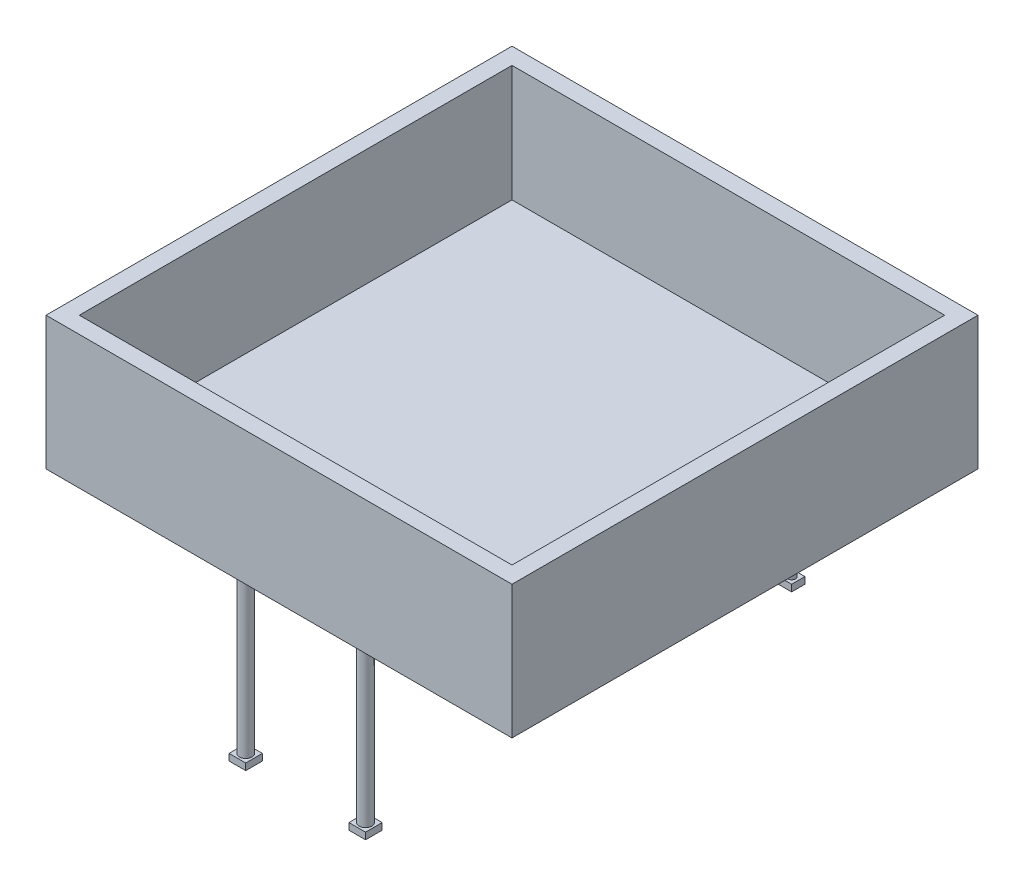
ISO-10303-21;
HEADER;
FILE_DESCRIPTION(('STEP AP214'),'2;1');
FILE_NAME('part.step','',(''),(''),'','','');
FILE_SCHEMA(('AUTOMOTIVE_DESIGN { 1 0 10303 214 1 1 1 1 }'));
ENDSEC;
DATA;
#1=APPLICATION_CONTEXT('core data for automotive mechanical design processes');
#2=APPLICATION_PROTOCOL_DEFINITION('international standard','automotive_design',2000,#1);
#3=PRODUCT_CONTEXT('',#1,'mechanical');
#4=PRODUCT('Part','Part','',(#3));
#5=PRODUCT_RELATED_PRODUCT_CATEGORY('part','',(#4));
#6=PRODUCT_DEFINITION_FORMATION('','',#4);
#7=PRODUCT_DEFINITION_CONTEXT('part definition',#1,'design');
#8=PRODUCT_DEFINITION('design','',#6,#7);
#9=PRODUCT_DEFINITION_SHAPE('','',#8);
#10=(LENGTH_UNIT() NAMED_UNIT(*) SI_UNIT(.MILLI.,.METRE.));
#11=(NAMED_UNIT(*) PLANE_ANGLE_UNIT() SI_UNIT($,.RADIAN.));
#12=(NAMED_UNIT(*) SI_UNIT($,.STERADIAN.) SOLID_ANGLE_UNIT());
#13=UNCERTAINTY_MEASURE_WITH_UNIT(LENGTH_MEASURE(1.E-05),#10,'distance_accuracy_value','');
#14=(GEOMETRIC_REPRESENTATION_CONTEXT(3) GLOBAL_UNCERTAINTY_ASSIGNED_CONTEXT((#13)) GLOBAL_UNIT_ASSIGNED_CONTEXT((#10,
#11,#12)) REPRESENTATION_CONTEXT('',''));
#15=CARTESIAN_POINT('',(0.,0.,0.));
#16=DIRECTION('',(0.,0.,1.));
#17=DIRECTION('',(1.,0.,0.));
#18=AXIS2_PLACEMENT_3D('',#15,#16,#17);
#19=CARTESIAN_POINT('',(-70.,40.,70.));
#20=DIRECTION('',(1.,0.,0.));
#21=DIRECTION('',(0.,0.,-1.));
#22=AXIS2_PLACEMENT_3D('',#19,#20,#21);
#23=PLANE('',#22);
#24=DIRECTION('',(0.,0.,1.));
#25=VECTOR('',#24,1.);
#26=CARTESIAN_POINT('',(-70.,0.,70.));
#27=LINE('',#26,#25);
#28=CARTESIAN_POINT('',(-70.,0.,-70.));
#29=VERTEX_POINT('',#28);
#30=CARTESIAN_POINT('',(-70.,0.,70.));
#31=VERTEX_POINT('',#30);
#32=EDGE_CURVE('E363',#29,#31,#27,.T.);
#33=ORIENTED_EDGE('',*,*,#32,.T.);
#34=DIRECTION('',(0.,-1.,0.));
#35=VECTOR('',#34,1.);
#36=CARTESIAN_POINT('',(-70.,40.,70.));
#37=LINE('',#36,#35);
#38=CARTESIAN_POINT('',(-70.,40.,70.));
#39=VERTEX_POINT('',#38);
#40=EDGE_CURVE('E389',#39,#31,#37,.T.);
#41=ORIENTED_EDGE('',*,*,#40,.F.);
#42=DIRECTION('',(0.,0.,1.));
#43=VECTOR('',#42,1.);
#44=CARTESIAN_POINT('',(-70.,40.,70.));
#45=LINE('',#44,#43);
#46=CARTESIAN_POINT('',(-70.,40.,-70.));
#47=VERTEX_POINT('',#46);
#48=EDGE_CURVE('E369',#47,#39,#45,.T.);
#49=ORIENTED_EDGE('',*,*,#48,.F.);
#50=DIRECTION('',(0.,-1.,0.));
#51=VECTOR('',#50,1.);
#52=CARTESIAN_POINT('',(-70.,40.,-70.));
#53=LINE('',#52,#51);
#54=EDGE_CURVE('E375',#47,#29,#53,.T.);
#55=ORIENTED_EDGE('',*,*,#54,.T.);
#56=EDGE_LOOP('',(#33,#41,#49,#55));
#57=FACE_BOUND('',#56,.T.);
#58=ADVANCED_FACE('F36',(#57),#23,.F.);
#59=CARTESIAN_POINT('',(70.,40.,70.));
#60=DIRECTION('',(0.,0.,-1.));
#61=DIRECTION('',(-1.,0.,0.));
#62=AXIS2_PLACEMENT_3D('',#59,#60,#61);
#63=PLANE('',#62);
#64=DIRECTION('',(1.,0.,0.));
#65=VECTOR('',#64,1.);
#66=CARTESIAN_POINT('',(70.,0.,70.));
#67=LINE('',#66,#65);
#68=CARTESIAN_POINT('',(70.,0.,70.));
#69=VERTEX_POINT('',#68);
#70=EDGE_CURVE('E378',#31,#69,#67,.T.);
#71=ORIENTED_EDGE('',*,*,#70,.T.);
#72=DIRECTION('',(0.,-1.,0.));
#73=VECTOR('',#72,1.);
#74=CARTESIAN_POINT('',(70.,40.,70.));
#75=LINE('',#74,#73);
#76=CARTESIAN_POINT('',(70.,40.,70.));
#77=VERTEX_POINT('',#76);
#78=EDGE_CURVE('E386',#77,#69,#75,.T.);
#79=ORIENTED_EDGE('',*,*,#78,.F.);
#80=DIRECTION('',(1.,0.,0.));
#81=VECTOR('',#80,1.);
#82=CARTESIAN_POINT('',(70.,40.,70.));
#83=LINE('',#82,#81);
#84=EDGE_CURVE('E88',#39,#77,#83,.T.);
#85=ORIENTED_EDGE('',*,*,#84,.F.);
#86=ORIENTED_EDGE('',*,*,#40,.T.);
#87=EDGE_LOOP('',(#71,#79,#85,#86));
#88=FACE_BOUND('',#87,.T.);
#89=ADVANCED_FACE('F422',(#88),#63,.F.);
#90=CARTESIAN_POINT('',(70.,40.,70.));
#91=DIRECTION('',(-1.,0.,0.));
#92=DIRECTION('',(0.,0.,1.));
#93=AXIS2_PLACEMENT_3D('',#90,#91,#92);
#94=PLANE('',#93);
#95=DIRECTION('',(0.,0.,-1.));
#96=VECTOR('',#95,1.);
#97=CARTESIAN_POINT('',(70.,0.,70.));
#98=LINE('',#97,#96);
#99=CARTESIAN_POINT('',(70.,0.,-70.));
#100=VERTEX_POINT('',#99);
#101=EDGE_CURVE('E380',#69,#100,#98,.T.);
#102=ORIENTED_EDGE('',*,*,#101,.T.);
#103=DIRECTION('',(0.,-1.,0.));
#104=VECTOR('',#103,1.);
#105=CARTESIAN_POINT('',(70.,40.,-70.));
#106=LINE('',#105,#104);
#107=CARTESIAN_POINT('',(70.,40.,-70.));
#108=VERTEX_POINT('',#107);
#109=EDGE_CURVE('E384',#108,#100,#106,.T.);
#110=ORIENTED_EDGE('',*,*,#109,.F.);
#111=DIRECTION('',(0.,0.,-1.));
#112=VECTOR('',#111,1.);
#113=CARTESIAN_POINT('',(70.,40.,70.));
#114=LINE('',#113,#112);
#115=EDGE_CURVE('E372',#77,#108,#114,.T.);
#116=ORIENTED_EDGE('',*,*,#115,.F.);
#117=ORIENTED_EDGE('',*,*,#78,.T.);
#118=EDGE_LOOP('',(#102,#110,#116,#117));
#119=FACE_BOUND('',#118,.T.);
#120=ADVANCED_FACE('F421',(#119),#94,.F.);
#121=CARTESIAN_POINT('',(70.,40.,-70.));
#122=DIRECTION('',(0.,0.,1.));
#123=DIRECTION('',(1.,0.,0.));
#124=AXIS2_PLACEMENT_3D('',#121,#122,#123);
#125=PLANE('',#124);
#126=DIRECTION('',(-1.,0.,0.));
#127=VECTOR('',#126,1.);
#128=CARTESIAN_POINT('',(70.,0.,-70.));
#129=LINE('',#128,#127);
#130=EDGE_CURVE('E80',#100,#29,#129,.T.);
#131=ORIENTED_EDGE('',*,*,#130,.T.);
#132=ORIENTED_EDGE('',*,*,#54,.F.);
#133=DIRECTION('',(-1.,0.,0.));
#134=VECTOR('',#133,1.);
#135=CARTESIAN_POINT('',(70.,40.,-70.));
#136=LINE('',#135,#134);
#137=EDGE_CURVE('E59',#108,#47,#136,.T.);
#138=ORIENTED_EDGE('',*,*,#137,.F.);
#139=ORIENTED_EDGE('',*,*,#109,.T.);
#140=EDGE_LOOP('',(#131,#132,#138,#139));
#141=FACE_BOUND('',#140,.T.);
#142=ADVANCED_FACE('F417',(#141),#125,.F.);
#143=CARTESIAN_POINT('',(0.,40.,0.));
#144=DIRECTION('',(0.,1.,0.));
#145=DIRECTION('',(0.,0.,1.));
#146=AXIS2_PLACEMENT_3D('',#143,#144,#145);
#147=PLANE('',#146);
#148=DIRECTION('',(-1.,0.,0.));
#149=VECTOR('',#148,1.);
#150=CARTESIAN_POINT('',(65.,40.,-65.));
#151=LINE('',#150,#149);
#152=CARTESIAN_POINT('',(65.,40.,-65.));
#153=VERTEX_POINT('',#152);
#154=CARTESIAN_POINT('',(-65.,40.,-65.));
#155=VERTEX_POINT('',#154);
#156=EDGE_CURVE('E50',#153,#155,#151,.T.);
#157=ORIENTED_EDGE('',*,*,#156,.F.);
#158=DIRECTION('',(0.,0.,-1.));
#159=VECTOR('',#158,1.);
#160=CARTESIAN_POINT('',(65.,40.,65.));
#161=LINE('',#160,#159);
#162=CARTESIAN_POINT('',(65.,40.,65.));
#163=VERTEX_POINT('',#162);
#164=EDGE_CURVE('E342',#163,#153,#161,.T.);
#165=ORIENTED_EDGE('',*,*,#164,.F.);
#166=DIRECTION('',(1.,0.,0.));
#167=VECTOR('',#166,1.);
#168=CARTESIAN_POINT('',(-65.,40.,65.));
#169=LINE('',#168,#167);
#170=CARTESIAN_POINT('',(-65.,40.,65.));
#171=VERTEX_POINT('',#170);
#172=EDGE_CURVE('E356',#171,#163,#169,.T.);
#173=ORIENTED_EDGE('',*,*,#172,.F.);
#174=DIRECTION('',(0.,0.,1.));
#175=VECTOR('',#174,1.);
#176=CARTESIAN_POINT('',(-65.,40.,-65.));
#177=LINE('',#176,#175);
#178=EDGE_CURVE('E353',#155,#171,#177,.T.);
#179=ORIENTED_EDGE('',*,*,#178,.F.);
#180=EDGE_LOOP('',(#157,#165,#173,#179));
#181=FACE_BOUND('',#180,.T.);
#182=ORIENTED_EDGE('',*,*,#48,.T.);
#183=ORIENTED_EDGE('',*,*,#84,.T.);
#184=ORIENTED_EDGE('',*,*,#115,.T.);
#185=ORIENTED_EDGE('',*,*,#137,.T.);
#186=EDGE_LOOP('',(#182,#183,#184,#185));
#187=FACE_BOUND('',#186,.T.);
#188=ADVANCED_FACE('F405',(#181,#187),#147,.T.);
#189=CARTESIAN_POINT('',(0.,0.,0.));
#190=DIRECTION('',(0.,1.,0.));
#191=DIRECTION('',(0.,0.,1.));
#192=AXIS2_PLACEMENT_3D('',#189,#190,#191);
#193=PLANE('',#192);
#194=CARTESIAN_POINT('',(20.,0.,-64.));
#195=DIRECTION('',(0.,1.,0.));
#196=DIRECTION('',(0.,0.,1.));
#197=AXIS2_PLACEMENT_3D('',#194,#195,#196);
#198=CIRCLE('',#197,1.20000000000001);
#199=CARTESIAN_POINT('',(20.,0.,-62.8));
#200=VERTEX_POINT('',#199);
#201=EDGE_CURVE('E11',#200,#200,#198,.F.);
#202=ORIENTED_EDGE('',*,*,#201,.F.);
#203=EDGE_LOOP('',(#202));
#204=FACE_BOUND('',#203,.T.);
#205=CARTESIAN_POINT('',(20.,0.,64.));
#206=DIRECTION('',(0.,1.,0.));
#207=DIRECTION('',(0.,0.,1.));
#208=AXIS2_PLACEMENT_3D('',#205,#206,#207);
#209=CIRCLE('',#208,1.9);
#210=CARTESIAN_POINT('',(20.,0.,65.9));
#211=VERTEX_POINT('',#210);
#212=EDGE_CURVE('E43',#211,#211,#209,.F.);
#213=ORIENTED_EDGE('',*,*,#212,.F.);
#214=EDGE_LOOP('',(#213));
#215=FACE_BOUND('',#214,.T.);
#216=CARTESIAN_POINT('',(-16.,0.,64.));
#217=DIRECTION('',(0.,1.,0.));
#218=DIRECTION('',(0.,0.,1.));
#219=AXIS2_PLACEMENT_3D('',#216,#217,#218);
#220=CIRCLE('',#219,1.9);
#221=CARTESIAN_POINT('',(-16.,0.,65.9));
#222=VERTEX_POINT('',#221);
#223=EDGE_CURVE('E394',#222,#222,#220,.F.);
#224=ORIENTED_EDGE('',*,*,#223,.F.);
#225=EDGE_LOOP('',(#224));
#226=FACE_BOUND('',#225,.T.);
#227=CARTESIAN_POINT('',(-16.,0.,-64.));
#228=DIRECTION('',(0.,1.,0.));
#229=DIRECTION('',(0.,0.,1.));
#230=AXIS2_PLACEMENT_3D('',#227,#228,#229);
#231=CIRCLE('',#230,1.20000000000001);
#232=CARTESIAN_POINT('',(-16.,0.,-62.8));
#233=VERTEX_POINT('',#232);
#234=EDGE_CURVE('E391',#233,#233,#231,.F.);
#235=ORIENTED_EDGE('',*,*,#234,.F.);
#236=EDGE_LOOP('',(#235));
#237=FACE_BOUND('',#236,.T.);
#238=ORIENTED_EDGE('',*,*,#32,.F.);
#239=ORIENTED_EDGE('',*,*,#130,.F.);
#240=ORIENTED_EDGE('',*,*,#101,.F.);
#241=ORIENTED_EDGE('',*,*,#70,.F.);
#242=EDGE_LOOP('',(#238,#239,#240,#241));
#243=FACE_BOUND('',#242,.T.);
#244=ADVANCED_FACE('F401',(#204,#215,#226,#237,#243),#193,.F.);
#245=CARTESIAN_POINT('',(65.,5.,-65.));
#246=DIRECTION('',(0.,0.,-1.));
#247=DIRECTION('',(-1.,0.,0.));
#248=AXIS2_PLACEMENT_3D('',#245,#246,#247);
#249=PLANE('',#248);
#250=ORIENTED_EDGE('',*,*,#156,.T.);
#251=DIRECTION('',(0.,1.,0.));
#252=VECTOR('',#251,1.);
#253=CARTESIAN_POINT('',(-65.,5.,-65.));
#254=LINE('',#253,#252);
#255=CARTESIAN_POINT('',(-65.,5.,-65.));
#256=VERTEX_POINT('',#255);
#257=EDGE_CURVE('E351',#256,#155,#254,.T.);
#258=ORIENTED_EDGE('',*,*,#257,.F.);
#259=DIRECTION('',(-1.,0.,0.));
#260=VECTOR('',#259,1.);
#261=CARTESIAN_POINT('',(65.,5.,-65.));
#262=LINE('',#261,#260);
#263=CARTESIAN_POINT('',(65.,5.,-65.));
#264=VERTEX_POINT('',#263);
#265=EDGE_CURVE('E338',#264,#256,#262,.T.);
#266=ORIENTED_EDGE('',*,*,#265,.F.);
#267=DIRECTION('',(0.,1.,0.));
#268=VECTOR('',#267,1.);
#269=CARTESIAN_POINT('',(65.,5.,-65.));
#270=LINE('',#269,#268);
#271=EDGE_CURVE('E361',#264,#153,#270,.T.);
#272=ORIENTED_EDGE('',*,*,#271,.T.);
#273=EDGE_LOOP('',(#250,#258,#266,#272));
#274=FACE_BOUND('',#273,.T.);
#275=ADVANCED_FACE('F404',(#274),#249,.F.);
#276=CARTESIAN_POINT('',(65.,5.,65.));
#277=DIRECTION('',(1.,0.,0.));
#278=DIRECTION('',(0.,0.,-1.));
#279=AXIS2_PLACEMENT_3D('',#276,#277,#278);
#280=PLANE('',#279);
#281=ORIENTED_EDGE('',*,*,#164,.T.);
#282=ORIENTED_EDGE('',*,*,#271,.F.);
#283=DIRECTION('',(0.,0.,-1.));
#284=VECTOR('',#283,1.);
#285=CARTESIAN_POINT('',(65.,5.,65.));
#286=LINE('',#285,#284);
#287=CARTESIAN_POINT('',(65.,5.,65.));
#288=VERTEX_POINT('',#287);
#289=EDGE_CURVE('E348',#288,#264,#286,.T.);
#290=ORIENTED_EDGE('',*,*,#289,.F.);
#291=DIRECTION('',(0.,1.,0.));
#292=VECTOR('',#291,1.);
#293=CARTESIAN_POINT('',(65.,5.,65.));
#294=LINE('',#293,#292);
#295=EDGE_CURVE('E364',#288,#163,#294,.T.);
#296=ORIENTED_EDGE('',*,*,#295,.T.);
#297=EDGE_LOOP('',(#281,#282,#290,#296));
#298=FACE_BOUND('',#297,.T.);
#299=ADVANCED_FACE('F437',(#298),#280,.F.);
#300=CARTESIAN_POINT('',(-65.,5.,65.));
#301=DIRECTION('',(0.,0.,1.));
#302=DIRECTION('',(1.,0.,0.));
#303=AXIS2_PLACEMENT_3D('',#300,#301,#302);
#304=PLANE('',#303);
#305=ORIENTED_EDGE('',*,*,#172,.T.);
#306=ORIENTED_EDGE('',*,*,#295,.F.);
#307=DIRECTION('',(1.,0.,0.));
#308=VECTOR('',#307,1.);
#309=CARTESIAN_POINT('',(-65.,5.,65.));
#310=LINE('',#309,#308);
#311=CARTESIAN_POINT('',(-65.,5.,65.));
#312=VERTEX_POINT('',#311);
#313=EDGE_CURVE('E345',#312,#288,#310,.T.);
#314=ORIENTED_EDGE('',*,*,#313,.F.);
#315=DIRECTION('',(0.,1.,0.));
#316=VECTOR('',#315,1.);
#317=CARTESIAN_POINT('',(-65.,5.,65.));
#318=LINE('',#317,#316);
#319=EDGE_CURVE('E366',#312,#171,#318,.T.);
#320=ORIENTED_EDGE('',*,*,#319,.T.);
#321=EDGE_LOOP('',(#305,#306,#314,#320));
#322=FACE_BOUND('',#321,.T.);
#323=ADVANCED_FACE('F442',(#322),#304,.F.);
#324=CARTESIAN_POINT('',(-65.,5.,-65.));
#325=DIRECTION('',(-1.,0.,0.));
#326=DIRECTION('',(0.,0.,1.));
#327=AXIS2_PLACEMENT_3D('',#324,#325,#326);
#328=PLANE('',#327);
#329=ORIENTED_EDGE('',*,*,#178,.T.);
#330=ORIENTED_EDGE('',*,*,#319,.F.);
#331=DIRECTION('',(0.,0.,1.));
#332=VECTOR('',#331,1.);
#333=CARTESIAN_POINT('',(-65.,5.,-65.));
#334=LINE('',#333,#332);
#335=EDGE_CURVE('E341',#256,#312,#334,.T.);
#336=ORIENTED_EDGE('',*,*,#335,.F.);
#337=ORIENTED_EDGE('',*,*,#257,.T.);
#338=EDGE_LOOP('',(#329,#330,#336,#337));
#339=FACE_BOUND('',#338,.T.);
#340=ADVANCED_FACE('F438',(#339),#328,.F.);
#341=CARTESIAN_POINT('',(0.,5.,0.));
#342=DIRECTION('',(0.,1.,0.));
#343=DIRECTION('',(0.,0.,1.));
#344=AXIS2_PLACEMENT_3D('',#341,#342,#343);
#345=PLANE('',#344);
#346=ORIENTED_EDGE('',*,*,#265,.T.);
#347=ORIENTED_EDGE('',*,*,#335,.T.);
#348=ORIENTED_EDGE('',*,*,#313,.T.);
#349=ORIENTED_EDGE('',*,*,#289,.T.);
#350=EDGE_LOOP('',(#346,#347,#348,#349));
#351=FACE_BOUND('',#350,.T.);
#352=ADVANCED_FACE('F441',(#351),#345,.T.);
#353=CARTESIAN_POINT('',(-16.,-50.,-64.));
#354=DIRECTION('',(0.,1.,0.));
#355=DIRECTION('',(0.,0.,1.));
#356=AXIS2_PLACEMENT_3D('',#353,#354,#355);
#357=CYLINDRICAL_SURFACE('',#356,1.20000000000001);
#358=CARTESIAN_POINT('',(-16.,-50.,-64.));
#359=DIRECTION('',(0.,-1.,0.));
#360=DIRECTION('',(0.,0.,-1.));
#361=AXIS2_PLACEMENT_3D('',#358,#359,#360);
#362=CIRCLE('',#361,1.20000000000001);
#363=CARTESIAN_POINT('',(-16.,-50.,-65.2));
#364=VERTEX_POINT('',#363);
#365=EDGE_CURVE('E335',#364,#364,#362,.T.);
#366=ORIENTED_EDGE('',*,*,#365,.F.);
#367=EDGE_LOOP('',(#366));
#368=FACE_BOUND('',#367,.T.);
#369=ORIENTED_EDGE('',*,*,#234,.T.);
#370=EDGE_LOOP('',(#369));
#371=FACE_BOUND('',#370,.T.);
#372=ADVANCED_FACE('F452',(#368,#371),#357,.T.);
#373=CARTESIAN_POINT('',(-16.,-50.,64.));
#374=DIRECTION('',(0.,1.,0.));
#375=DIRECTION('',(0.,0.,1.));
#376=AXIS2_PLACEMENT_3D('',#373,#374,#375);
#377=CYLINDRICAL_SURFACE('',#376,1.9);
#378=CARTESIAN_POINT('',(-16.,-50.,64.));
#379=DIRECTION('',(0.,-1.,0.));
#380=DIRECTION('',(0.,0.,-1.));
#381=AXIS2_PLACEMENT_3D('',#378,#379,#380);
#382=CIRCLE('',#381,1.9);
#383=CARTESIAN_POINT('',(-16.,-50.,62.1));
#384=VERTEX_POINT('',#383);
#385=EDGE_CURVE('E332',#384,#384,#382,.T.);
#386=ORIENTED_EDGE('',*,*,#385,.F.);
#387=EDGE_LOOP('',(#386));
#388=FACE_BOUND('',#387,.T.);
#389=ORIENTED_EDGE('',*,*,#223,.T.);
#390=EDGE_LOOP('',(#389));
#391=FACE_BOUND('',#390,.T.);
#392=ADVANCED_FACE('F456',(#388,#391),#377,.T.);
#393=CARTESIAN_POINT('',(20.,-50.,64.));
#394=DIRECTION('',(0.,1.,0.));
#395=DIRECTION('',(0.,0.,1.));
#396=AXIS2_PLACEMENT_3D('',#393,#394,#395);
#397=CYLINDRICAL_SURFACE('',#396,1.9);
#398=CARTESIAN_POINT('',(20.,-50.,64.));
#399=DIRECTION('',(0.,-1.,0.));
#400=DIRECTION('',(0.,0.,1.));
#401=AXIS2_PLACEMENT_3D('',#398,#399,#400);
#402=CIRCLE('',#401,1.9);
#403=CARTESIAN_POINT('',(20.,-50.,65.9));
#404=VERTEX_POINT('',#403);
#405=EDGE_CURVE('E329',#404,#404,#402,.T.);
#406=ORIENTED_EDGE('',*,*,#405,.F.);
#407=EDGE_LOOP('',(#406));
#408=FACE_BOUND('',#407,.T.);
#409=ORIENTED_EDGE('',*,*,#212,.T.);
#410=EDGE_LOOP('',(#409));
#411=FACE_BOUND('',#410,.T.);
#412=ADVANCED_FACE('F399',(#408,#411),#397,.T.);
#413=CARTESIAN_POINT('',(20.,-50.,-64.));
#414=DIRECTION('',(0.,1.,0.));
#415=DIRECTION('',(0.,0.,1.));
#416=AXIS2_PLACEMENT_3D('',#413,#414,#415);
#417=CYLINDRICAL_SURFACE('',#416,1.20000000000001);
#418=CARTESIAN_POINT('',(20.,-50.,-64.));
#419=DIRECTION('',(0.,-1.,0.));
#420=DIRECTION('',(0.,0.,1.));
#421=AXIS2_PLACEMENT_3D('',#418,#419,#420);
#422=CIRCLE('',#421,1.20000000000001);
#423=CARTESIAN_POINT('',(20.,-50.,-62.8));
#424=VERTEX_POINT('',#423);
#425=EDGE_CURVE('E326',#424,#424,#422,.T.);
#426=ORIENTED_EDGE('',*,*,#425,.F.);
#427=EDGE_LOOP('',(#426));
#428=FACE_BOUND('',#427,.T.);
#429=ORIENTED_EDGE('',*,*,#201,.T.);
#430=EDGE_LOOP('',(#429));
#431=FACE_BOUND('',#430,.T.);
#432=ADVANCED_FACE('F463',(#428,#431),#417,.T.);
#433=CARTESIAN_POINT('',(-18.5,-52.,61.5));
#434=DIRECTION('',(1.,0.,0.));
#435=DIRECTION('',(0.,0.,-1.));
#436=AXIS2_PLACEMENT_3D('',#433,#434,#435);
#437=PLANE('',#436);
#438=DIRECTION('',(0.,0.,-1.));
#439=VECTOR('',#438,1.);
#440=CARTESIAN_POINT('',(-18.5,-50.,61.5));
#441=LINE('',#440,#439);
#442=CARTESIAN_POINT('',(-18.5,-50.,66.5));
#443=VERTEX_POINT('',#442);
#444=CARTESIAN_POINT('',(-18.5,-50.,61.5));
#445=VERTEX_POINT('',#444);
#446=EDGE_CURVE('E296',#443,#445,#441,.T.);
#447=ORIENTED_EDGE('',*,*,#446,.T.);
#448=DIRECTION('',(0.,1.,0.));
#449=VECTOR('',#448,1.);
#450=CARTESIAN_POINT('',(-18.5,-52.,61.5));
#451=LINE('',#450,#449);
#452=CARTESIAN_POINT('',(-18.5,-52.,61.5));
#453=VERTEX_POINT('',#452);
#454=EDGE_CURVE('E323',#453,#445,#451,.T.);
#455=ORIENTED_EDGE('',*,*,#454,.F.);
#456=DIRECTION('',(0.,0.,-1.));
#457=VECTOR('',#456,1.);
#458=CARTESIAN_POINT('',(-18.5,-52.,61.5));
#459=LINE('',#458,#457);
#460=CARTESIAN_POINT('',(-18.5,-52.,66.5));
#461=VERTEX_POINT('',#460);
#462=EDGE_CURVE('E297',#461,#453,#459,.T.);
#463=ORIENTED_EDGE('',*,*,#462,.F.);
#464=DIRECTION('',(0.,1.,0.));
#465=VECTOR('',#464,1.);
#466=CARTESIAN_POINT('',(-18.5,-52.,66.5));
#467=LINE('',#466,#465);
#468=EDGE_CURVE('E307',#461,#443,#467,.T.);
#469=ORIENTED_EDGE('',*,*,#468,.T.);
#470=EDGE_LOOP('',(#447,#455,#463,#469));
#471=FACE_BOUND('',#470,.T.);
#472=ADVANCED_FACE('F467',(#471),#437,.F.);
#473=CARTESIAN_POINT('',(-13.5,-52.,61.5));
#474=DIRECTION('',(0.,0.,1.));
#475=DIRECTION('',(1.,0.,0.));
#476=AXIS2_PLACEMENT_3D('',#473,#474,#475);
#477=PLANE('',#476);
#478=DIRECTION('',(1.,0.,0.));
#479=VECTOR('',#478,1.);
#480=CARTESIAN_POINT('',(-13.5,-50.,61.5));
#481=LINE('',#480,#479);
#482=CARTESIAN_POINT('',(-13.5,-50.,61.5));
#483=VERTEX_POINT('',#482);
#484=EDGE_CURVE('E310',#445,#483,#481,.T.);
#485=ORIENTED_EDGE('',*,*,#484,.T.);
#486=DIRECTION('',(0.,1.,0.));
#487=VECTOR('',#486,1.);
#488=CARTESIAN_POINT('',(-13.5,-52.,61.5));
#489=LINE('',#488,#487);
#490=CARTESIAN_POINT('',(-13.5,-52.,61.5));
#491=VERTEX_POINT('',#490);
#492=EDGE_CURVE('E320',#491,#483,#489,.T.);
#493=ORIENTED_EDGE('',*,*,#492,.F.);
#494=DIRECTION('',(1.,0.,0.));
#495=VECTOR('',#494,1.);
#496=CARTESIAN_POINT('',(-13.5,-52.,61.5));
#497=LINE('',#496,#495);
#498=EDGE_CURVE('E300',#453,#491,#497,.T.);
#499=ORIENTED_EDGE('',*,*,#498,.F.);
#500=ORIENTED_EDGE('',*,*,#454,.T.);
#501=EDGE_LOOP('',(#485,#493,#499,#500));
#502=FACE_BOUND('',#501,.T.);
#503=ADVANCED_FACE('F471',(#502),#477,.F.);
#504=CARTESIAN_POINT('',(-13.5,-52.,61.5));
#505=DIRECTION('',(-1.,0.,0.));
#506=DIRECTION('',(0.,0.,1.));
#507=AXIS2_PLACEMENT_3D('',#504,#505,#506);
#508=PLANE('',#507);
#509=DIRECTION('',(0.,0.,1.));
#510=VECTOR('',#509,1.);
#511=CARTESIAN_POINT('',(-13.5,-50.,61.5));
#512=LINE('',#511,#510);
#513=CARTESIAN_POINT('',(-13.5,-50.,66.5));
#514=VERTEX_POINT('',#513);
#515=EDGE_CURVE('E312',#483,#514,#512,.T.);
#516=ORIENTED_EDGE('',*,*,#515,.T.);
#517=DIRECTION('',(0.,1.,0.));
#518=VECTOR('',#517,1.);
#519=CARTESIAN_POINT('',(-13.5,-52.,66.5));
#520=LINE('',#519,#518);
#521=CARTESIAN_POINT('',(-13.5,-52.,66.5));
#522=VERTEX_POINT('',#521);
#523=EDGE_CURVE('E317',#522,#514,#520,.T.);
#524=ORIENTED_EDGE('',*,*,#523,.F.);
#525=DIRECTION('',(0.,0.,1.));
#526=VECTOR('',#525,1.);
#527=CARTESIAN_POINT('',(-13.5,-52.,61.5));
#528=LINE('',#527,#526);
#529=EDGE_CURVE('E303',#491,#522,#528,.T.);
#530=ORIENTED_EDGE('',*,*,#529,.F.);
#531=ORIENTED_EDGE('',*,*,#492,.T.);
#532=EDGE_LOOP('',(#516,#524,#530,#531));
#533=FACE_BOUND('',#532,.T.);
#534=ADVANCED_FACE('F475',(#533),#508,.F.);
#535=CARTESIAN_POINT('',(-13.5,-52.,66.5));
#536=DIRECTION('',(0.,0.,-1.));
#537=DIRECTION('',(-1.,0.,0.));
#538=AXIS2_PLACEMENT_3D('',#535,#536,#537);
#539=PLANE('',#538);
#540=DIRECTION('',(-1.,0.,0.));
#541=VECTOR('',#540,1.);
#542=CARTESIAN_POINT('',(-13.5,-50.,66.5));
#543=LINE('',#542,#541);
#544=EDGE_CURVE('E301',#514,#443,#543,.T.);
#545=ORIENTED_EDGE('',*,*,#544,.T.);
#546=ORIENTED_EDGE('',*,*,#468,.F.);
#547=DIRECTION('',(-1.,0.,0.));
#548=VECTOR('',#547,1.);
#549=CARTESIAN_POINT('',(-13.5,-52.,66.5));
#550=LINE('',#549,#548);
#551=EDGE_CURVE('E305',#522,#461,#550,.T.);
#552=ORIENTED_EDGE('',*,*,#551,.F.);
#553=ORIENTED_EDGE('',*,*,#523,.T.);
#554=EDGE_LOOP('',(#545,#546,#552,#553));
#555=FACE_BOUND('',#554,.T.);
#556=ADVANCED_FACE('F479',(#555),#539,.F.);
#557=CARTESIAN_POINT('',(0.,-52.,0.));
#558=DIRECTION('',(0.,-1.,0.));
#559=DIRECTION('',(0.,0.,-1.));
#560=AXIS2_PLACEMENT_3D('',#557,#558,#559);
#561=PLANE('',#560);
#562=ORIENTED_EDGE('',*,*,#462,.T.);
#563=ORIENTED_EDGE('',*,*,#498,.T.);
#564=ORIENTED_EDGE('',*,*,#529,.T.);
#565=ORIENTED_EDGE('',*,*,#551,.T.);
#566=EDGE_LOOP('',(#562,#563,#564,#565));
#567=FACE_BOUND('',#566,.T.);
#568=ADVANCED_FACE('F483',(#567),#561,.T.);
#569=CARTESIAN_POINT('',(0.,-50.,0.));
#570=DIRECTION('',(0.,-1.,0.));
#571=DIRECTION('',(0.,0.,-1.));
#572=AXIS2_PLACEMENT_3D('',#569,#570,#571);
#573=PLANE('',#572);
#574=ORIENTED_EDGE('',*,*,#385,.T.);
#575=EDGE_LOOP('',(#574));
#576=FACE_BOUND('',#575,.T.);
#577=ORIENTED_EDGE('',*,*,#446,.F.);
#578=ORIENTED_EDGE('',*,*,#544,.F.);
#579=ORIENTED_EDGE('',*,*,#515,.F.);
#580=ORIENTED_EDGE('',*,*,#484,.F.);
#581=EDGE_LOOP('',(#577,#578,#579,#580));
#582=FACE_BOUND('',#581,.T.);
#583=ADVANCED_FACE('F485',(#576,#582),#573,.F.);
#584=CARTESIAN_POINT('',(17.5,-52.,66.5));
#585=DIRECTION('',(1.,0.,0.));
#586=DIRECTION('',(0.,0.,-1.));
#587=AXIS2_PLACEMENT_3D('',#584,#585,#586);
#588=PLANE('',#587);
#589=DIRECTION('',(0.,0.,-1.));
#590=VECTOR('',#589,1.);
#591=CARTESIAN_POINT('',(17.5,-50.,66.5));
#592=LINE('',#591,#590);
#593=CARTESIAN_POINT('',(17.5,-50.,66.5));
#594=VERTEX_POINT('',#593);
#595=CARTESIAN_POINT('',(17.5,-50.,61.5));
#596=VERTEX_POINT('',#595);
#597=EDGE_CURVE('E266',#594,#596,#592,.T.);
#598=ORIENTED_EDGE('',*,*,#597,.T.);
#599=DIRECTION('',(0.,1.,0.));
#600=VECTOR('',#599,1.);
#601=CARTESIAN_POINT('',(17.5,-52.,61.5));
#602=LINE('',#601,#600);
#603=CARTESIAN_POINT('',(17.5,-52.,61.5));
#604=VERTEX_POINT('',#603);
#605=EDGE_CURVE('E293',#604,#596,#602,.T.);
#606=ORIENTED_EDGE('',*,*,#605,.F.);
#607=DIRECTION('',(0.,0.,-1.));
#608=VECTOR('',#607,1.);
#609=CARTESIAN_POINT('',(17.5,-52.,66.5));
#610=LINE('',#609,#608);
#611=CARTESIAN_POINT('',(17.5,-52.,66.5));
#612=VERTEX_POINT('',#611);
#613=EDGE_CURVE('E267',#612,#604,#610,.T.);
#614=ORIENTED_EDGE('',*,*,#613,.F.);
#615=DIRECTION('',(0.,1.,0.));
#616=VECTOR('',#615,1.);
#617=CARTESIAN_POINT('',(17.5,-52.,66.5));
#618=LINE('',#617,#616);
#619=EDGE_CURVE('E277',#612,#594,#618,.T.);
#620=ORIENTED_EDGE('',*,*,#619,.T.);
#621=EDGE_LOOP('',(#598,#606,#614,#620));
#622=FACE_BOUND('',#621,.T.);
#623=ADVANCED_FACE('F488',(#622),#588,.F.);
#624=CARTESIAN_POINT('',(22.5,-52.,61.5));
#625=DIRECTION('',(0.,0.,1.));
#626=DIRECTION('',(1.,0.,0.));
#627=AXIS2_PLACEMENT_3D('',#624,#625,#626);
#628=PLANE('',#627);
#629=DIRECTION('',(1.,0.,0.));
#630=VECTOR('',#629,1.);
#631=CARTESIAN_POINT('',(22.5,-50.,61.5));
#632=LINE('',#631,#630);
#633=CARTESIAN_POINT('',(22.5,-50.,61.5));
#634=VERTEX_POINT('',#633);
#635=EDGE_CURVE('E280',#596,#634,#632,.T.);
#636=ORIENTED_EDGE('',*,*,#635,.T.);
#637=DIRECTION('',(0.,1.,0.));
#638=VECTOR('',#637,1.);
#639=CARTESIAN_POINT('',(22.5,-52.,61.5));
#640=LINE('',#639,#638);
#641=CARTESIAN_POINT('',(22.5,-52.,61.5));
#642=VERTEX_POINT('',#641);
#643=EDGE_CURVE('E290',#642,#634,#640,.T.);
#644=ORIENTED_EDGE('',*,*,#643,.F.);
#645=DIRECTION('',(1.,0.,0.));
#646=VECTOR('',#645,1.);
#647=CARTESIAN_POINT('',(22.5,-52.,61.5));
#648=LINE('',#647,#646);
#649=EDGE_CURVE('E270',#604,#642,#648,.T.);
#650=ORIENTED_EDGE('',*,*,#649,.F.);
#651=ORIENTED_EDGE('',*,*,#605,.T.);
#652=EDGE_LOOP('',(#636,#644,#650,#651));
#653=FACE_BOUND('',#652,.T.);
#654=ADVANCED_FACE('F495',(#653),#628,.F.);
#655=CARTESIAN_POINT('',(22.5,-52.,66.5));
#656=DIRECTION('',(-1.,0.,0.));
#657=DIRECTION('',(0.,0.,1.));
#658=AXIS2_PLACEMENT_3D('',#655,#656,#657);
#659=PLANE('',#658);
#660=DIRECTION('',(0.,0.,1.));
#661=VECTOR('',#660,1.);
#662=CARTESIAN_POINT('',(22.5,-50.,66.5));
#663=LINE('',#662,#661);
#664=CARTESIAN_POINT('',(22.5,-50.,66.5));
#665=VERTEX_POINT('',#664);
#666=EDGE_CURVE('E282',#634,#665,#663,.T.);
#667=ORIENTED_EDGE('',*,*,#666,.T.);
#668=DIRECTION('',(0.,1.,0.));
#669=VECTOR('',#668,1.);
#670=CARTESIAN_POINT('',(22.5,-52.,66.5));
#671=LINE('',#670,#669);
#672=CARTESIAN_POINT('',(22.5,-52.,66.5));
#673=VERTEX_POINT('',#672);
#674=EDGE_CURVE('E287',#673,#665,#671,.T.);
#675=ORIENTED_EDGE('',*,*,#674,.F.);
#676=DIRECTION('',(0.,0.,1.));
#677=VECTOR('',#676,1.);
#678=CARTESIAN_POINT('',(22.5,-52.,66.5));
#679=LINE('',#678,#677);
#680=EDGE_CURVE('E273',#642,#673,#679,.T.);
#681=ORIENTED_EDGE('',*,*,#680,.F.);
#682=ORIENTED_EDGE('',*,*,#643,.T.);
#683=EDGE_LOOP('',(#667,#675,#681,#682));
#684=FACE_BOUND('',#683,.T.);
#685=ADVANCED_FACE('F499',(#684),#659,.F.);
#686=CARTESIAN_POINT('',(22.5,-52.,66.5));
#687=DIRECTION('',(0.,0.,-1.));
#688=DIRECTION('',(-1.,0.,0.));
#689=AXIS2_PLACEMENT_3D('',#686,#687,#688);
#690=PLANE('',#689);
#691=DIRECTION('',(-1.,0.,0.));
#692=VECTOR('',#691,1.);
#693=CARTESIAN_POINT('',(22.5,-50.,66.5));
#694=LINE('',#693,#692);
#695=EDGE_CURVE('E271',#665,#594,#694,.T.);
#696=ORIENTED_EDGE('',*,*,#695,.T.);
#697=ORIENTED_EDGE('',*,*,#619,.F.);
#698=DIRECTION('',(-1.,0.,0.));
#699=VECTOR('',#698,1.);
#700=CARTESIAN_POINT('',(22.5,-52.,66.5));
#701=LINE('',#700,#699);
#702=EDGE_CURVE('E275',#673,#612,#701,.T.);
#703=ORIENTED_EDGE('',*,*,#702,.F.);
#704=ORIENTED_EDGE('',*,*,#674,.T.);
#705=EDGE_LOOP('',(#696,#697,#703,#704));
#706=FACE_BOUND('',#705,.T.);
#707=ADVANCED_FACE('F503',(#706),#690,.F.);
#708=CARTESIAN_POINT('',(0.,-52.,0.));
#709=DIRECTION('',(0.,1.,0.));
#710=DIRECTION('',(0.,0.,1.));
#711=AXIS2_PLACEMENT_3D('',#708,#709,#710);
#712=PLANE('',#711);
#713=ORIENTED_EDGE('',*,*,#613,.T.);
#714=ORIENTED_EDGE('',*,*,#649,.T.);
#715=ORIENTED_EDGE('',*,*,#680,.T.);
#716=ORIENTED_EDGE('',*,*,#702,.T.);
#717=EDGE_LOOP('',(#713,#714,#715,#716));
#718=FACE_BOUND('',#717,.T.);
#719=ADVANCED_FACE('F507',(#718),#712,.F.);
#720=CARTESIAN_POINT('',(0.,-50.,0.));
#721=DIRECTION('',(0.,1.,0.));
#722=DIRECTION('',(0.,0.,1.));
#723=AXIS2_PLACEMENT_3D('',#720,#721,#722);
#724=PLANE('',#723);
#725=ORIENTED_EDGE('',*,*,#405,.T.);
#726=EDGE_LOOP('',(#725));
#727=FACE_BOUND('',#726,.T.);
#728=ORIENTED_EDGE('',*,*,#597,.F.);
#729=ORIENTED_EDGE('',*,*,#695,.F.);
#730=ORIENTED_EDGE('',*,*,#666,.F.);
#731=ORIENTED_EDGE('',*,*,#635,.F.);
#732=EDGE_LOOP('',(#728,#729,#730,#731));
#733=FACE_BOUND('',#732,.T.);
#734=ADVANCED_FACE('F509',(#727,#733),#724,.T.);
#735=CARTESIAN_POINT('',(-18.,-52.,-66.));
#736=DIRECTION('',(1.,0.,0.));
#737=DIRECTION('',(0.,0.,-1.));
#738=AXIS2_PLACEMENT_3D('',#735,#736,#737);
#739=PLANE('',#738);
#740=DIRECTION('',(0.,0.,-1.));
#741=VECTOR('',#740,1.);
#742=CARTESIAN_POINT('',(-18.,-50.,-66.));
#743=LINE('',#742,#741);
#744=CARTESIAN_POINT('',(-18.,-50.,-62.));
#745=VERTEX_POINT('',#744);
#746=CARTESIAN_POINT('',(-18.,-50.,-66.));
#747=VERTEX_POINT('',#746);
#748=EDGE_CURVE('E231',#745,#747,#743,.T.);
#749=ORIENTED_EDGE('',*,*,#748,.T.);
#750=DIRECTION('',(0.,1.,0.));
#751=VECTOR('',#750,1.);
#752=CARTESIAN_POINT('',(-18.,-52.,-66.));
#753=LINE('',#752,#751);
#754=CARTESIAN_POINT('',(-18.,-52.,-66.));
#755=VERTEX_POINT('',#754);
#756=EDGE_CURVE('E263',#755,#747,#753,.T.);
#757=ORIENTED_EDGE('',*,*,#756,.F.);
#758=DIRECTION('',(0.,0.,-1.));
#759=VECTOR('',#758,1.);
#760=CARTESIAN_POINT('',(-18.,-52.,-66.));
#761=LINE('',#760,#759);
#762=CARTESIAN_POINT('',(-18.,-52.,-62.));
#763=VERTEX_POINT('',#762);
#764=EDGE_CURVE('E240',#763,#755,#761,.T.);
#765=ORIENTED_EDGE('',*,*,#764,.F.);
#766=DIRECTION('',(0.,1.,0.));
#767=VECTOR('',#766,1.);
#768=CARTESIAN_POINT('',(-18.,-52.,-62.));
#769=LINE('',#768,#767);
#770=EDGE_CURVE('E249',#763,#745,#769,.T.);
#771=ORIENTED_EDGE('',*,*,#770,.T.);
#772=EDGE_LOOP('',(#749,#757,#765,#771));
#773=FACE_BOUND('',#772,.T.);
#774=ADVANCED_FACE('F512',(#773),#739,.F.);
#775=CARTESIAN_POINT('',(-14.,-52.,-66.));
#776=DIRECTION('',(0.,0.,1.));
#777=DIRECTION('',(1.,0.,0.));
#778=AXIS2_PLACEMENT_3D('',#775,#776,#777);
#779=PLANE('',#778);
#780=DIRECTION('',(1.,0.,0.));
#781=VECTOR('',#780,1.);
#782=CARTESIAN_POINT('',(-14.,-50.,-66.));
#783=LINE('',#782,#781);
#784=CARTESIAN_POINT('',(-14.,-50.,-66.));
#785=VERTEX_POINT('',#784);
#786=EDGE_CURVE('E234',#747,#785,#783,.T.);
#787=ORIENTED_EDGE('',*,*,#786,.T.);
#788=DIRECTION('',(0.,1.,0.));
#789=VECTOR('',#788,1.);
#790=CARTESIAN_POINT('',(-14.,-52.,-66.));
#791=LINE('',#790,#789);
#792=CARTESIAN_POINT('',(-14.,-52.,-66.));
#793=VERTEX_POINT('',#792);
#794=EDGE_CURVE('E260',#793,#785,#791,.T.);
#795=ORIENTED_EDGE('',*,*,#794,.F.);
#796=DIRECTION('',(1.,0.,0.));
#797=VECTOR('',#796,1.);
#798=CARTESIAN_POINT('',(-14.,-52.,-66.));
#799=LINE('',#798,#797);
#800=EDGE_CURVE('E243',#755,#793,#799,.T.);
#801=ORIENTED_EDGE('',*,*,#800,.F.);
#802=ORIENTED_EDGE('',*,*,#756,.T.);
#803=EDGE_LOOP('',(#787,#795,#801,#802));
#804=FACE_BOUND('',#803,.T.);
#805=ADVANCED_FACE('F519',(#804),#779,.F.);
#806=CARTESIAN_POINT('',(-14.,-52.,-66.));
#807=DIRECTION('',(-1.,0.,0.));
#808=DIRECTION('',(0.,0.,1.));
#809=AXIS2_PLACEMENT_3D('',#806,#807,#808);
#810=PLANE('',#809);
#811=DIRECTION('',(0.,0.,1.));
#812=VECTOR('',#811,1.);
#813=CARTESIAN_POINT('',(-14.,-50.,-66.));
#814=LINE('',#813,#812);
#815=CARTESIAN_POINT('',(-14.,-50.,-62.));
#816=VERTEX_POINT('',#815);
#817=EDGE_CURVE('E252',#785,#816,#814,.T.);
#818=ORIENTED_EDGE('',*,*,#817,.T.);
#819=DIRECTION('',(0.,1.,0.));
#820=VECTOR('',#819,1.);
#821=CARTESIAN_POINT('',(-14.,-52.,-62.));
#822=LINE('',#821,#820);
#823=CARTESIAN_POINT('',(-14.,-52.,-62.));
#824=VERTEX_POINT('',#823);
#825=EDGE_CURVE('E257',#824,#816,#822,.T.);
#826=ORIENTED_EDGE('',*,*,#825,.F.);
#827=DIRECTION('',(0.,0.,1.));
#828=VECTOR('',#827,1.);
#829=CARTESIAN_POINT('',(-14.,-52.,-66.));
#830=LINE('',#829,#828);
#831=EDGE_CURVE('E246',#793,#824,#830,.T.);
#832=ORIENTED_EDGE('',*,*,#831,.F.);
#833=ORIENTED_EDGE('',*,*,#794,.T.);
#834=EDGE_LOOP('',(#818,#826,#832,#833));
#835=FACE_BOUND('',#834,.T.);
#836=ADVANCED_FACE('F523',(#835),#810,.F.);
#837=CARTESIAN_POINT('',(-14.,-52.,-62.));
#838=DIRECTION('',(0.,0.,-1.));
#839=DIRECTION('',(-1.,0.,0.));
#840=AXIS2_PLACEMENT_3D('',#837,#838,#839);
#841=PLANE('',#840);
#842=DIRECTION('',(-1.,0.,0.));
#843=VECTOR('',#842,1.);
#844=CARTESIAN_POINT('',(-14.,-50.,-62.));
#845=LINE('',#844,#843);
#846=EDGE_CURVE('E244',#816,#745,#845,.T.);
#847=ORIENTED_EDGE('',*,*,#846,.T.);
#848=ORIENTED_EDGE('',*,*,#770,.F.);
#849=DIRECTION('',(-1.,0.,0.));
#850=VECTOR('',#849,1.);
#851=CARTESIAN_POINT('',(-14.,-52.,-62.));
#852=LINE('',#851,#850);
#853=EDGE_CURVE('E248',#824,#763,#852,.T.);
#854=ORIENTED_EDGE('',*,*,#853,.F.);
#855=ORIENTED_EDGE('',*,*,#825,.T.);
#856=EDGE_LOOP('',(#847,#848,#854,#855));
#857=FACE_BOUND('',#856,.T.);
#858=ADVANCED_FACE('F527',(#857),#841,.F.);
#859=CARTESIAN_POINT('',(0.,-52.,0.));
#860=DIRECTION('',(0.,-1.,0.));
#861=DIRECTION('',(0.,0.,-1.));
#862=AXIS2_PLACEMENT_3D('',#859,#860,#861);
#863=PLANE('',#862);
#864=ORIENTED_EDGE('',*,*,#764,.T.);
#865=ORIENTED_EDGE('',*,*,#800,.T.);
#866=ORIENTED_EDGE('',*,*,#831,.T.);
#867=ORIENTED_EDGE('',*,*,#853,.T.);
#868=EDGE_LOOP('',(#864,#865,#866,#867));
#869=FACE_BOUND('',#868,.T.);
#870=ADVANCED_FACE('F531',(#869),#863,.T.);
#871=CARTESIAN_POINT('',(0.,-50.,0.));
#872=DIRECTION('',(0.,-1.,0.));
#873=DIRECTION('',(0.,0.,-1.));
#874=AXIS2_PLACEMENT_3D('',#871,#872,#873);
#875=PLANE('',#874);
#876=ORIENTED_EDGE('',*,*,#365,.T.);
#877=EDGE_LOOP('',(#876));
#878=FACE_BOUND('',#877,.T.);
#879=ORIENTED_EDGE('',*,*,#748,.F.);
#880=ORIENTED_EDGE('',*,*,#846,.F.);
#881=ORIENTED_EDGE('',*,*,#817,.F.);
#882=ORIENTED_EDGE('',*,*,#786,.F.);
#883=EDGE_LOOP('',(#879,#880,#881,#882));
#884=FACE_BOUND('',#883,.T.);
#885=ADVANCED_FACE('F533',(#878,#884),#875,.F.);
#886=CARTESIAN_POINT('',(18.,-52.,-66.));
#887=DIRECTION('',(1.,0.,0.));
#888=DIRECTION('',(0.,0.,-1.));
#889=AXIS2_PLACEMENT_3D('',#886,#887,#888);
#890=PLANE('',#889);
#891=DIRECTION('',(0.,0.,-1.));
#892=VECTOR('',#891,1.);
#893=CARTESIAN_POINT('',(18.,-50.,-66.));
#894=LINE('',#893,#892);
#895=CARTESIAN_POINT('',(18.,-50.,-62.));
#896=VERTEX_POINT('',#895);
#897=CARTESIAN_POINT('',(18.,-50.,-66.));
#898=VERTEX_POINT('',#897);
#899=EDGE_CURVE('E230',#896,#898,#894,.T.);
#900=ORIENTED_EDGE('',*,*,#899,.T.);
#901=DIRECTION('',(0.,1.,0.));
#902=VECTOR('',#901,1.);
#903=CARTESIAN_POINT('',(18.,-52.,-66.));
#904=LINE('',#903,#902);
#905=CARTESIAN_POINT('',(18.,-52.,-66.));
#906=VERTEX_POINT('',#905);
#907=EDGE_CURVE('E210',#906,#898,#904,.T.);
#908=ORIENTED_EDGE('',*,*,#907,.F.);
#909=DIRECTION('',(0.,0.,-1.));
#910=VECTOR('',#909,1.);
#911=CARTESIAN_POINT('',(18.,-52.,-66.));
#912=LINE('',#911,#910);
#913=CARTESIAN_POINT('',(18.,-52.,-62.));
#914=VERTEX_POINT('',#913);
#915=EDGE_CURVE('E217',#914,#906,#912,.T.);
#916=ORIENTED_EDGE('',*,*,#915,.F.);
#917=DIRECTION('',(0.,1.,0.));
#918=VECTOR('',#917,1.);
#919=CARTESIAN_POINT('',(18.,-52.,-62.));
#920=LINE('',#919,#918);
#921=EDGE_CURVE('E802',#914,#896,#920,.T.);
#922=ORIENTED_EDGE('',*,*,#921,.T.);
#923=EDGE_LOOP('',(#900,#908,#916,#922));
#924=FACE_BOUND('',#923,.T.);
#925=ADVANCED_FACE('F228',(#924),#890,.F.);
#926=CARTESIAN_POINT('',(22.,-52.,-66.));
#927=DIRECTION('',(0.,0.,1.));
#928=DIRECTION('',(1.,0.,0.));
#929=AXIS2_PLACEMENT_3D('',#926,#927,#928);
#930=PLANE('',#929);
#931=DIRECTION('',(1.,0.,0.));
#932=VECTOR('',#931,1.);
#933=CARTESIAN_POINT('',(22.,-50.,-66.));
#934=LINE('',#933,#932);
#935=CARTESIAN_POINT('',(22.,-50.,-66.));
#936=VERTEX_POINT('',#935);
#937=EDGE_CURVE('E793',#898,#936,#934,.T.);
#938=ORIENTED_EDGE('',*,*,#937,.T.);
#939=DIRECTION('',(0.,1.,0.));
#940=VECTOR('',#939,1.);
#941=CARTESIAN_POINT('',(22.,-52.,-66.));
#942=LINE('',#941,#940);
#943=CARTESIAN_POINT('',(22.,-52.,-66.));
#944=VERTEX_POINT('',#943);
#945=EDGE_CURVE('E213',#944,#936,#942,.T.);
#946=ORIENTED_EDGE('',*,*,#945,.F.);
#947=DIRECTION('',(1.,0.,0.));
#948=VECTOR('',#947,1.);
#949=CARTESIAN_POINT('',(22.,-52.,-66.));
#950=LINE('',#949,#948);
#951=EDGE_CURVE('E206',#906,#944,#950,.T.);
#952=ORIENTED_EDGE('',*,*,#951,.F.);
#953=ORIENTED_EDGE('',*,*,#907,.T.);
#954=EDGE_LOOP('',(#938,#946,#952,#953));
#955=FACE_BOUND('',#954,.T.);
#956=ADVANCED_FACE('F208',(#955),#930,.F.);
#957=CARTESIAN_POINT('',(22.,-52.,-66.));
#958=DIRECTION('',(-1.,0.,0.));
#959=DIRECTION('',(0.,0.,1.));
#960=AXIS2_PLACEMENT_3D('',#957,#958,#959);
#961=PLANE('',#960);
#962=DIRECTION('',(0.,0.,1.));
#963=VECTOR('',#962,1.);
#964=CARTESIAN_POINT('',(22.,-50.,-66.));
#965=LINE('',#964,#963);
#966=CARTESIAN_POINT('',(22.,-50.,-62.));
#967=VERTEX_POINT('',#966);
#968=EDGE_CURVE('E795',#936,#967,#965,.T.);
#969=ORIENTED_EDGE('',*,*,#968,.T.);
#970=DIRECTION('',(0.,1.,0.));
#971=VECTOR('',#970,1.);
#972=CARTESIAN_POINT('',(22.,-52.,-62.));
#973=LINE('',#972,#971);
#974=CARTESIAN_POINT('',(22.,-52.,-62.));
#975=VERTEX_POINT('',#974);
#976=EDGE_CURVE('E236',#975,#967,#973,.T.);
#977=ORIENTED_EDGE('',*,*,#976,.F.);
#978=DIRECTION('',(0.,0.,1.));
#979=VECTOR('',#978,1.);
#980=CARTESIAN_POINT('',(22.,-52.,-66.));
#981=LINE('',#980,#979);
#982=EDGE_CURVE('E216',#944,#975,#981,.T.);
#983=ORIENTED_EDGE('',*,*,#982,.F.);
#984=ORIENTED_EDGE('',*,*,#945,.T.);
#985=EDGE_LOOP('',(#969,#977,#983,#984));
#986=FACE_BOUND('',#985,.T.);
#987=ADVANCED_FACE('F544',(#986),#961,.F.);
#988=CARTESIAN_POINT('',(22.,-52.,-62.));
#989=DIRECTION('',(0.,0.,-1.));
#990=DIRECTION('',(-1.,0.,0.));
#991=AXIS2_PLACEMENT_3D('',#988,#989,#990);
#992=PLANE('',#991);
#993=DIRECTION('',(-1.,0.,0.));
#994=VECTOR('',#993,1.);
#995=CARTESIAN_POINT('',(22.,-50.,-62.));
#996=LINE('',#995,#994);
#997=EDGE_CURVE('E226',#967,#896,#996,.T.);
#998=ORIENTED_EDGE('',*,*,#997,.T.);
#999=ORIENTED_EDGE('',*,*,#921,.F.);
#1000=DIRECTION('',(-1.,0.,0.));
#1001=VECTOR('',#1000,1.);
#1002=CARTESIAN_POINT('',(22.,-52.,-62.));
#1003=LINE('',#1002,#1001);
#1004=EDGE_CURVE('E222',#975,#914,#1003,.T.);
#1005=ORIENTED_EDGE('',*,*,#1004,.F.);
#1006=ORIENTED_EDGE('',*,*,#976,.T.);
#1007=EDGE_LOOP('',(#998,#999,#1005,#1006));
#1008=FACE_BOUND('',#1007,.T.);
#1009=ADVANCED_FACE('F547',(#1008),#992,.F.);
#1010=CARTESIAN_POINT('',(0.,-52.,0.));
#1011=DIRECTION('',(0.,-1.,0.));
#1012=DIRECTION('',(0.,0.,-1.));
#1013=AXIS2_PLACEMENT_3D('',#1010,#1011,#1012);
#1014=PLANE('',#1013);
#1015=ORIENTED_EDGE('',*,*,#915,.T.);
#1016=ORIENTED_EDGE('',*,*,#951,.T.);
#1017=ORIENTED_EDGE('',*,*,#982,.T.);
#1018=ORIENTED_EDGE('',*,*,#1004,.T.);
#1019=EDGE_LOOP('',(#1015,#1016,#1017,#1018));
#1020=FACE_BOUND('',#1019,.T.);
#1021=ADVANCED_FACE('F220',(#1020),#1014,.T.);
#1022=CARTESIAN_POINT('',(0.,-50.,0.));
#1023=DIRECTION('',(0.,-1.,0.));
#1024=DIRECTION('',(0.,0.,-1.));
#1025=AXIS2_PLACEMENT_3D('',#1022,#1023,#1024);
#1026=PLANE('',#1025);
#1027=ORIENTED_EDGE('',*,*,#425,.T.);
#1028=EDGE_LOOP('',(#1027));
#1029=FACE_BOUND('',#1028,.T.);
#1030=ORIENTED_EDGE('',*,*,#899,.F.);
#1031=ORIENTED_EDGE('',*,*,#997,.F.);
#1032=ORIENTED_EDGE('',*,*,#968,.F.);
#1033=ORIENTED_EDGE('',*,*,#937,.F.);
#1034=EDGE_LOOP('',(#1030,#1031,#1032,#1033));
#1035=FACE_BOUND('',#1034,.T.);
#1036=ADVANCED_FACE('F552',(#1029,#1035),#1026,.F.);
#1037=CLOSED_SHELL('',(#58,#89,#120,#142,#188,#244,#275,#299,#323,#340,#352,#372,#392,#412,#432,
#472,#503,#534,#556,#568,#583,#623,#654,#685,#707,#719,#734,#774,#805,#836,#858,#870,#885,#925,
#956,#987,#1009,#1021,#1036));
#1038=MANIFOLD_SOLID_BREP('B2',#1037);
#1039=ADVANCED_BREP_SHAPE_REPRESENTATION('',(#18,#1038),#14);
#1040=SHAPE_DEFINITION_REPRESENTATION(#9,#1039);
ENDSEC;
END-ISO-10303-21;
